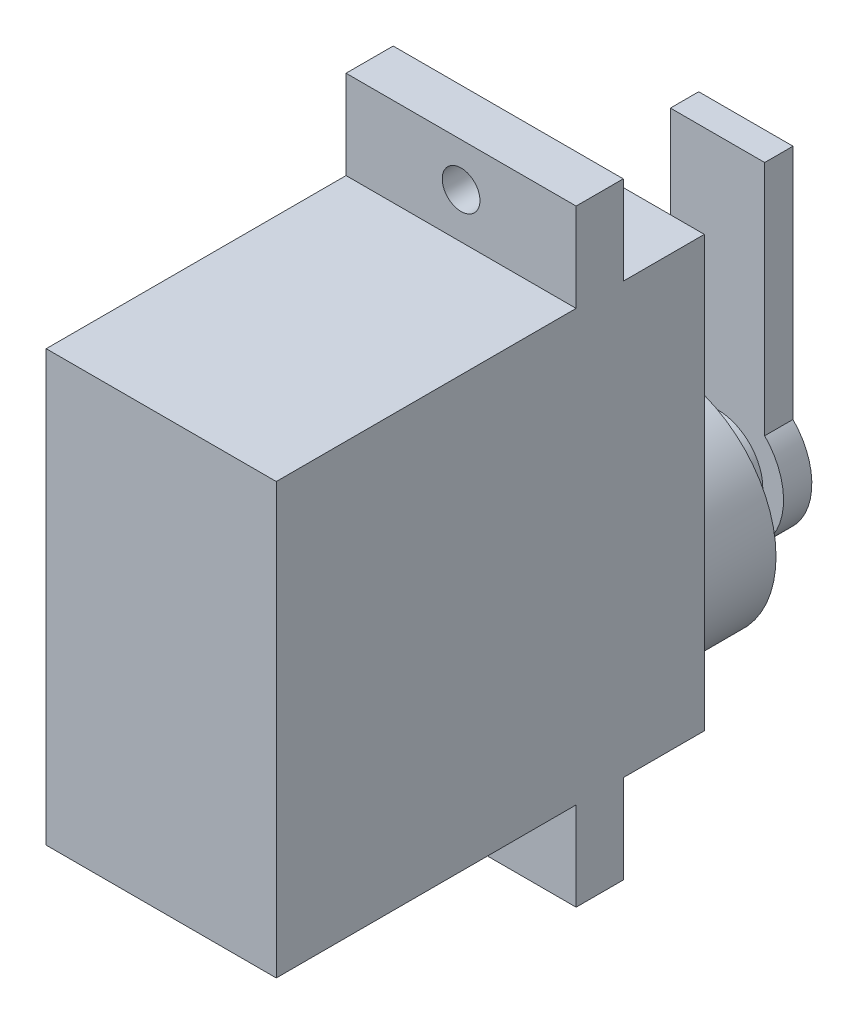
ISO-10303-21;
HEADER;
FILE_DESCRIPTION(('STEP AP214'),'2;1');
FILE_NAME('part.step','',(''),(''),'','','');
FILE_SCHEMA(('AUTOMOTIVE_DESIGN { 1 0 10303 214 1 1 1 1 }'));
ENDSEC;
DATA;
#1=APPLICATION_CONTEXT('core data for automotive mechanical design processes');
#2=APPLICATION_PROTOCOL_DEFINITION('international standard','automotive_design',2000,#1);
#3=PRODUCT_CONTEXT('',#1,'mechanical');
#4=PRODUCT('Part','Part','',(#3));
#5=PRODUCT_RELATED_PRODUCT_CATEGORY('part','',(#4));
#6=PRODUCT_DEFINITION_FORMATION('','',#4);
#7=PRODUCT_DEFINITION_CONTEXT('part definition',#1,'design');
#8=PRODUCT_DEFINITION('design','',#6,#7);
#9=PRODUCT_DEFINITION_SHAPE('','',#8);
#10=(LENGTH_UNIT() NAMED_UNIT(*) SI_UNIT(.MILLI.,.METRE.));
#11=(NAMED_UNIT(*) PLANE_ANGLE_UNIT() SI_UNIT($,.RADIAN.));
#12=(NAMED_UNIT(*) SI_UNIT($,.STERADIAN.) SOLID_ANGLE_UNIT());
#13=UNCERTAINTY_MEASURE_WITH_UNIT(LENGTH_MEASURE(1.E-05),#10,'distance_accuracy_value','');
#14=(GEOMETRIC_REPRESENTATION_CONTEXT(3) GLOBAL_UNCERTAINTY_ASSIGNED_CONTEXT((#13)) GLOBAL_UNIT_ASSIGNED_CONTEXT((#10,
#11,#12)) REPRESENTATION_CONTEXT('',''));
#15=CARTESIAN_POINT('',(0.,0.,0.));
#16=DIRECTION('',(0.,0.,1.));
#17=DIRECTION('',(1.,0.,0.));
#18=AXIS2_PLACEMENT_3D('',#15,#16,#17);
#19=CARTESIAN_POINT('',(0.,0.,-11.1));
#20=DIRECTION('',(0.,0.,-1.));
#21=DIRECTION('',(-1.,0.,0.));
#22=AXIS2_PLACEMENT_3D('',#19,#20,#21);
#23=CYLINDRICAL_SURFACE('',#22,3.5);
#24=DIRECTION('',(0.,0.,-1.));
#25=VECTOR('',#24,1.);
#26=CARTESIAN_POINT('',(-2.5,2.44948974278318,-11.1));
#27=LINE('',#26,#25);
#28=CARTESIAN_POINT('',(-2.5,2.44948974278318,-12.6));
#29=VERTEX_POINT('',#28);
#30=CARTESIAN_POINT('',(-2.5,2.44948974278318,-11.1));
#31=VERTEX_POINT('',#30);
#32=EDGE_CURVE('E190',#29,#31,#27,.F.);
#33=ORIENTED_EDGE('',*,*,#32,.F.);
#34=CARTESIAN_POINT('',(0.,0.,-12.6));
#35=DIRECTION('',(0.,0.,1.));
#36=DIRECTION('',(1.,0.,0.));
#37=AXIS2_PLACEMENT_3D('',#34,#35,#36);
#38=CIRCLE('',#37,3.5);
#39=CARTESIAN_POINT('',(2.5,2.44948974278318,-12.6));
#40=VERTEX_POINT('',#39);
#41=EDGE_CURVE('E192',#29,#40,#38,.T.);
#42=ORIENTED_EDGE('',*,*,#41,.T.);
#43=DIRECTION('',(0.,0.,-1.));
#44=VECTOR('',#43,1.);
#45=CARTESIAN_POINT('',(2.5,2.44948974278318,-11.1));
#46=LINE('',#45,#44);
#47=CARTESIAN_POINT('',(2.5,2.44948974278318,-11.1));
#48=VERTEX_POINT('',#47);
#49=EDGE_CURVE('E63',#48,#40,#46,.T.);
#50=ORIENTED_EDGE('',*,*,#49,.F.);
#51=CARTESIAN_POINT('',(0.,0.,-11.1));
#52=DIRECTION('',(0.,0.,1.));
#53=DIRECTION('',(1.,0.,0.));
#54=AXIS2_PLACEMENT_3D('',#51,#52,#53);
#55=CIRCLE('',#54,3.5);
#56=EDGE_CURVE('E58',#31,#48,#55,.T.);
#57=ORIENTED_EDGE('',*,*,#56,.F.);
#58=EDGE_LOOP('',(#33,#42,#50,#57));
#59=FACE_BOUND('',#58,.T.);
#60=ADVANCED_FACE('F41',(#59),#23,.T.);
#61=CARTESIAN_POINT('',(-6.1,-5.9,18.4));
#62=DIRECTION('',(0.,1.,0.));
#63=DIRECTION('',(0.,0.,1.));
#64=AXIS2_PLACEMENT_3D('',#61,#62,#63);
#65=PLANE('',#64);
#66=DIRECTION('',(1.,0.,0.));
#67=VECTOR('',#66,1.);
#68=CARTESIAN_POINT('',(-6.1,-5.9,0.));
#69=LINE('',#68,#67);
#70=CARTESIAN_POINT('',(-6.1,-5.9,0.));
#71=VERTEX_POINT('',#70);
#72=CARTESIAN_POINT('',(6.1,-5.9,0.));
#73=VERTEX_POINT('',#72);
#74=EDGE_CURVE('E250',#71,#73,#69,.T.);
#75=ORIENTED_EDGE('',*,*,#74,.F.);
#76=DIRECTION('',(0.,0.,-1.));
#77=VECTOR('',#76,1.);
#78=CARTESIAN_POINT('',(-6.1,-5.9,18.4));
#79=LINE('',#78,#77);
#80=CARTESIAN_POINT('',(-6.1,-5.9,-4.3));
#81=VERTEX_POINT('',#80);
#82=EDGE_CURVE('E288',#71,#81,#79,.T.);
#83=ORIENTED_EDGE('',*,*,#82,.T.);
#84=DIRECTION('',(1.,0.,0.));
#85=VECTOR('',#84,1.);
#86=CARTESIAN_POINT('',(-6.1,-5.9,-4.3));
#87=LINE('',#86,#85);
#88=CARTESIAN_POINT('',(0.,-5.9,-4.3));
#89=VERTEX_POINT('',#88);
#90=EDGE_CURVE('E270',#81,#89,#87,.T.);
#91=ORIENTED_EDGE('',*,*,#90,.T.);
#92=CARTESIAN_POINT('',(6.1,-5.9,-4.3));
#93=VERTEX_POINT('',#92);
#94=EDGE_CURVE('E269',#89,#93,#87,.T.);
#95=ORIENTED_EDGE('',*,*,#94,.T.);
#96=DIRECTION('',(0.,0.,-1.));
#97=VECTOR('',#96,1.);
#98=CARTESIAN_POINT('',(6.1,-5.9,18.4));
#99=LINE('',#98,#97);
#100=EDGE_CURVE('E284',#73,#93,#99,.T.);
#101=ORIENTED_EDGE('',*,*,#100,.F.);
#102=EDGE_LOOP('',(#75,#83,#91,#95,#101));
#103=FACE_BOUND('',#102,.T.);
#104=ADVANCED_FACE('F314',(#103),#65,.F.);
#105=CARTESIAN_POINT('',(6.1,16.9,18.4));
#106=DIRECTION('',(0.,-1.,0.));
#107=DIRECTION('',(0.,0.,-1.));
#108=AXIS2_PLACEMENT_3D('',#105,#106,#107);
#109=PLANE('',#108);
#110=DIRECTION('',(-1.,0.,0.));
#111=VECTOR('',#110,1.);
#112=CARTESIAN_POINT('',(6.1,16.9,0.));
#113=LINE('',#112,#111);
#114=CARTESIAN_POINT('',(6.1,16.9,0.));
#115=VERTEX_POINT('',#114);
#116=CARTESIAN_POINT('',(-6.1,16.9,0.));
#117=VERTEX_POINT('',#116);
#118=EDGE_CURVE('E50',#115,#117,#113,.T.);
#119=ORIENTED_EDGE('',*,*,#118,.F.);
#120=DIRECTION('',(0.,0.,-1.));
#121=VECTOR('',#120,1.);
#122=CARTESIAN_POINT('',(6.1,16.9,18.4));
#123=LINE('',#122,#121);
#124=CARTESIAN_POINT('',(6.1,16.9,-4.3));
#125=VERTEX_POINT('',#124);
#126=EDGE_CURVE('E281',#115,#125,#123,.T.);
#127=ORIENTED_EDGE('',*,*,#126,.T.);
#128=DIRECTION('',(-1.,0.,0.));
#129=VECTOR('',#128,1.);
#130=CARTESIAN_POINT('',(6.1,16.9,-4.3));
#131=LINE('',#130,#129);
#132=CARTESIAN_POINT('',(-6.1,16.9,-4.3));
#133=VERTEX_POINT('',#132);
#134=EDGE_CURVE('E260',#125,#133,#131,.T.);
#135=ORIENTED_EDGE('',*,*,#134,.T.);
#136=DIRECTION('',(0.,0.,-1.));
#137=VECTOR('',#136,1.);
#138=CARTESIAN_POINT('',(-6.1,16.9,18.4));
#139=LINE('',#138,#137);
#140=EDGE_CURVE('E266',#117,#133,#139,.T.);
#141=ORIENTED_EDGE('',*,*,#140,.F.);
#142=EDGE_LOOP('',(#119,#127,#135,#141));
#143=FACE_BOUND('',#142,.T.);
#144=ADVANCED_FACE('F343',(#143),#109,.F.);
#145=CARTESIAN_POINT('',(-6.1,16.9,18.4));
#146=DIRECTION('',(1.,0.,0.));
#147=DIRECTION('',(0.,0.,-1.));
#148=AXIS2_PLACEMENT_3D('',#145,#146,#147);
#149=PLANE('',#148);
#150=CARTESIAN_POINT('',(-6.1,16.9,18.4));
#151=VERTEX_POINT('',#150);
#152=CARTESIAN_POINT('',(-6.1,16.9,2.5));
#153=VERTEX_POINT('',#152);
#154=EDGE_CURVE('E278',#151,#153,#139,.T.);
#155=ORIENTED_EDGE('',*,*,#154,.T.);
#156=DIRECTION('',(0.,-1.,0.));
#157=VECTOR('',#156,1.);
#158=CARTESIAN_POINT('',(-6.1,21.6,2.5));
#159=LINE('',#158,#157);
#160=CARTESIAN_POINT('',(-6.1,21.6,2.5));
#161=VERTEX_POINT('',#160);
#162=EDGE_CURVE('E215',#161,#153,#159,.T.);
#163=ORIENTED_EDGE('',*,*,#162,.F.);
#164=DIRECTION('',(0.,0.,-1.));
#165=VECTOR('',#164,1.);
#166=CARTESIAN_POINT('',(-6.1,21.6,2.5));
#167=LINE('',#166,#165);
#168=CARTESIAN_POINT('',(-6.1,21.6,0.));
#169=VERTEX_POINT('',#168);
#170=EDGE_CURVE('E227',#161,#169,#167,.T.);
#171=ORIENTED_EDGE('',*,*,#170,.T.);
#172=DIRECTION('',(0.,-1.,0.));
#173=VECTOR('',#172,1.);
#174=CARTESIAN_POINT('',(-6.1,21.6,0.));
#175=LINE('',#174,#173);
#176=EDGE_CURVE('E228',#169,#117,#175,.T.);
#177=ORIENTED_EDGE('',*,*,#176,.T.);
#178=ORIENTED_EDGE('',*,*,#140,.T.);
#179=DIRECTION('',(0.,-1.,0.));
#180=VECTOR('',#179,1.);
#181=CARTESIAN_POINT('',(-6.1,16.9,-4.3));
#182=LINE('',#181,#180);
#183=EDGE_CURVE('E255',#133,#81,#182,.T.);
#184=ORIENTED_EDGE('',*,*,#183,.T.);
#185=ORIENTED_EDGE('',*,*,#82,.F.);
#186=CARTESIAN_POINT('',(-6.1,-10.6,0.));
#187=VERTEX_POINT('',#186);
#188=EDGE_CURVE('E214',#71,#187,#175,.T.);
#189=ORIENTED_EDGE('',*,*,#188,.T.);
#190=DIRECTION('',(0.,0.,-1.));
#191=VECTOR('',#190,1.);
#192=CARTESIAN_POINT('',(-6.1,-10.6,2.5));
#193=LINE('',#192,#191);
#194=CARTESIAN_POINT('',(-6.1,-10.6,2.5));
#195=VERTEX_POINT('',#194);
#196=EDGE_CURVE('E247',#195,#187,#193,.T.);
#197=ORIENTED_EDGE('',*,*,#196,.F.);
#198=CARTESIAN_POINT('',(-6.1,-5.9,2.5));
#199=VERTEX_POINT('',#198);
#200=EDGE_CURVE('E219',#199,#195,#159,.T.);
#201=ORIENTED_EDGE('',*,*,#200,.F.);
#202=CARTESIAN_POINT('',(-6.1,-5.9,18.4));
#203=VERTEX_POINT('',#202);
#204=EDGE_CURVE('E289',#203,#199,#79,.T.);
#205=ORIENTED_EDGE('',*,*,#204,.F.);
#206=DIRECTION('',(0.,-1.,0.));
#207=VECTOR('',#206,1.);
#208=CARTESIAN_POINT('',(-6.1,16.9,18.4));
#209=LINE('',#208,#207);
#210=EDGE_CURVE('E256',#151,#203,#209,.T.);
#211=ORIENTED_EDGE('',*,*,#210,.F.);
#212=EDGE_LOOP('',(#155,#163,#171,#177,#178,#184,#185,#189,#197,#201,#205,#211));
#213=FACE_BOUND('',#212,.T.);
#214=ADVANCED_FACE('F43',(#213),#149,.F.);
#215=ORIENTED_EDGE('',*,*,#204,.T.);
#216=DIRECTION('',(1.,0.,0.));
#217=VECTOR('',#216,1.);
#218=CARTESIAN_POINT('',(-6.1,-5.9,2.5));
#219=LINE('',#218,#217);
#220=CARTESIAN_POINT('',(6.1,-5.9,2.5));
#221=VERTEX_POINT('',#220);
#222=EDGE_CURVE('E253',#199,#221,#219,.T.);
#223=ORIENTED_EDGE('',*,*,#222,.T.);
#224=CARTESIAN_POINT('',(6.1,-5.9,18.4));
#225=VERTEX_POINT('',#224);
#226=EDGE_CURVE('E285',#225,#221,#99,.T.);
#227=ORIENTED_EDGE('',*,*,#226,.F.);
#228=DIRECTION('',(1.,0.,0.));
#229=VECTOR('',#228,1.);
#230=CARTESIAN_POINT('',(-6.1,-5.9,18.4));
#231=LINE('',#230,#229);
#232=EDGE_CURVE('E259',#203,#225,#231,.T.);
#233=ORIENTED_EDGE('',*,*,#232,.F.);
#234=EDGE_LOOP('',(#215,#223,#227,#233));
#235=FACE_BOUND('',#234,.T.);
#236=ADVANCED_FACE('F344',(#235),#65,.F.);
#237=CARTESIAN_POINT('',(6.1,-5.9,18.4));
#238=DIRECTION('',(-1.,0.,0.));
#239=DIRECTION('',(0.,0.,1.));
#240=AXIS2_PLACEMENT_3D('',#237,#238,#239);
#241=PLANE('',#240);
#242=ORIENTED_EDGE('',*,*,#226,.T.);
#243=DIRECTION('',(0.,1.,0.));
#244=VECTOR('',#243,1.);
#245=CARTESIAN_POINT('',(6.1,-10.6,2.5));
#246=LINE('',#245,#244);
#247=CARTESIAN_POINT('',(6.1,-10.6,2.5));
#248=VERTEX_POINT('',#247);
#249=EDGE_CURVE('E222',#248,#221,#246,.T.);
#250=ORIENTED_EDGE('',*,*,#249,.F.);
#251=DIRECTION('',(0.,0.,-1.));
#252=VECTOR('',#251,1.);
#253=CARTESIAN_POINT('',(6.1,-10.6,2.5));
#254=LINE('',#253,#252);
#255=CARTESIAN_POINT('',(6.1,-10.6,0.));
#256=VERTEX_POINT('',#255);
#257=EDGE_CURVE('E244',#248,#256,#254,.T.);
#258=ORIENTED_EDGE('',*,*,#257,.T.);
#259=DIRECTION('',(0.,1.,0.));
#260=VECTOR('',#259,1.);
#261=CARTESIAN_POINT('',(6.1,-10.6,0.));
#262=LINE('',#261,#260);
#263=EDGE_CURVE('E234',#256,#73,#262,.T.);
#264=ORIENTED_EDGE('',*,*,#263,.T.);
#265=ORIENTED_EDGE('',*,*,#100,.T.);
#266=DIRECTION('',(0.,1.,0.));
#267=VECTOR('',#266,1.);
#268=CARTESIAN_POINT('',(6.1,-5.9,-4.3));
#269=LINE('',#268,#267);
#270=EDGE_CURVE('E273',#93,#125,#269,.T.);
#271=ORIENTED_EDGE('',*,*,#270,.T.);
#272=ORIENTED_EDGE('',*,*,#126,.F.);
#273=CARTESIAN_POINT('',(6.1,21.6,0.));
#274=VERTEX_POINT('',#273);
#275=EDGE_CURVE('E233',#115,#274,#262,.T.);
#276=ORIENTED_EDGE('',*,*,#275,.T.);
#277=DIRECTION('',(0.,0.,-1.));
#278=VECTOR('',#277,1.);
#279=CARTESIAN_POINT('',(6.1,21.6,2.5));
#280=LINE('',#279,#278);
#281=CARTESIAN_POINT('',(6.1,21.6,2.5));
#282=VERTEX_POINT('',#281);
#283=EDGE_CURVE('E241',#282,#274,#280,.T.);
#284=ORIENTED_EDGE('',*,*,#283,.F.);
#285=CARTESIAN_POINT('',(6.1,16.9,2.5));
#286=VERTEX_POINT('',#285);
#287=EDGE_CURVE('E221',#286,#282,#246,.T.);
#288=ORIENTED_EDGE('',*,*,#287,.F.);
#289=CARTESIAN_POINT('',(6.1,16.9,18.4));
#290=VERTEX_POINT('',#289);
#291=EDGE_CURVE('E282',#290,#286,#123,.T.);
#292=ORIENTED_EDGE('',*,*,#291,.F.);
#293=DIRECTION('',(0.,1.,0.));
#294=VECTOR('',#293,1.);
#295=CARTESIAN_POINT('',(6.1,-5.9,18.4));
#296=LINE('',#295,#294);
#297=EDGE_CURVE('E262',#225,#290,#296,.T.);
#298=ORIENTED_EDGE('',*,*,#297,.F.);
#299=EDGE_LOOP('',(#242,#250,#258,#264,#265,#271,#272,#276,#284,#288,#292,#298));
#300=FACE_BOUND('',#299,.T.);
#301=ADVANCED_FACE('F488',(#300),#241,.F.);
#302=ORIENTED_EDGE('',*,*,#291,.T.);
#303=DIRECTION('',(-1.,0.,0.));
#304=VECTOR('',#303,1.);
#305=CARTESIAN_POINT('',(6.1,16.9,2.5));
#306=LINE('',#305,#304);
#307=EDGE_CURVE('E11',#286,#153,#306,.T.);
#308=ORIENTED_EDGE('',*,*,#307,.T.);
#309=ORIENTED_EDGE('',*,*,#154,.F.);
#310=DIRECTION('',(-1.,0.,0.));
#311=VECTOR('',#310,1.);
#312=CARTESIAN_POINT('',(6.1,16.9,18.4));
#313=LINE('',#312,#311);
#314=EDGE_CURVE('E264',#290,#151,#313,.T.);
#315=ORIENTED_EDGE('',*,*,#314,.F.);
#316=EDGE_LOOP('',(#302,#308,#309,#315));
#317=FACE_BOUND('',#316,.T.);
#318=ADVANCED_FACE('F494',(#317),#109,.F.);
#319=CARTESIAN_POINT('',(0.,0.,18.4));
#320=DIRECTION('',(0.,0.,1.));
#321=DIRECTION('',(1.,0.,0.));
#322=AXIS2_PLACEMENT_3D('',#319,#320,#321);
#323=PLANE('',#322);
#324=ORIENTED_EDGE('',*,*,#210,.T.);
#325=ORIENTED_EDGE('',*,*,#232,.T.);
#326=ORIENTED_EDGE('',*,*,#297,.T.);
#327=ORIENTED_EDGE('',*,*,#314,.T.);
#328=EDGE_LOOP('',(#324,#325,#326,#327));
#329=FACE_BOUND('',#328,.T.);
#330=ADVANCED_FACE('F529',(#329),#323,.T.);
#331=CARTESIAN_POINT('',(0.,0.,-4.3));
#332=DIRECTION('',(0.,0.,1.));
#333=DIRECTION('',(1.,0.,0.));
#334=AXIS2_PLACEMENT_3D('',#331,#332,#333);
#335=PLANE('',#334);
#336=ORIENTED_EDGE('',*,*,#94,.F.);
#337=CARTESIAN_POINT('',(0.,0.,-4.3));
#338=DIRECTION('',(0.,0.,1.));
#339=DIRECTION('',(1.,0.,0.));
#340=AXIS2_PLACEMENT_3D('',#337,#338,#339);
#341=CIRCLE('',#340,5.9);
#342=EDGE_CURVE('E202',#89,#89,#341,.T.);
#343=ORIENTED_EDGE('',*,*,#342,.T.);
#344=ORIENTED_EDGE('',*,*,#90,.F.);
#345=ORIENTED_EDGE('',*,*,#183,.F.);
#346=ORIENTED_EDGE('',*,*,#134,.F.);
#347=ORIENTED_EDGE('',*,*,#270,.F.);
#348=EDGE_LOOP('',(#336,#343,#344,#345,#346,#347));
#349=FACE_BOUND('',#348,.T.);
#350=ADVANCED_FACE('F317',(#349),#335,.F.);
#351=CARTESIAN_POINT('',(6.1,21.6,2.5));
#352=DIRECTION('',(0.,-1.,0.));
#353=DIRECTION('',(0.,0.,-1.));
#354=AXIS2_PLACEMENT_3D('',#351,#352,#353);
#355=PLANE('',#354);
#356=DIRECTION('',(-1.,0.,0.));
#357=VECTOR('',#356,1.);
#358=CARTESIAN_POINT('',(6.1,21.6,0.));
#359=LINE('',#358,#357);
#360=EDGE_CURVE('E237',#274,#169,#359,.T.);
#361=ORIENTED_EDGE('',*,*,#360,.T.);
#362=ORIENTED_EDGE('',*,*,#170,.F.);
#363=DIRECTION('',(-1.,0.,0.));
#364=VECTOR('',#363,1.);
#365=CARTESIAN_POINT('',(6.1,21.6,2.5));
#366=LINE('',#365,#364);
#367=EDGE_CURVE('E225',#282,#161,#366,.T.);
#368=ORIENTED_EDGE('',*,*,#367,.F.);
#369=ORIENTED_EDGE('',*,*,#283,.T.);
#370=EDGE_LOOP('',(#361,#362,#368,#369));
#371=FACE_BOUND('',#370,.T.);
#372=ADVANCED_FACE('F474',(#371),#355,.F.);
#373=CARTESIAN_POINT('',(0.,0.,0.));
#374=DIRECTION('',(0.,0.,1.));
#375=DIRECTION('',(1.,0.,0.));
#376=AXIS2_PLACEMENT_3D('',#373,#374,#375);
#377=PLANE('',#376);
#378=CARTESIAN_POINT('',(0.,19.3,0.));
#379=DIRECTION('',(0.,0.,1.));
#380=DIRECTION('',(1.,0.,0.));
#381=AXIS2_PLACEMENT_3D('',#378,#379,#380);
#382=CIRCLE('',#381,1.);
#383=CARTESIAN_POINT('',(1.,19.3,0.));
#384=VERTEX_POINT('',#383);
#385=EDGE_CURVE('E211',#384,#384,#382,.F.);
#386=ORIENTED_EDGE('',*,*,#385,.F.);
#387=EDGE_LOOP('',(#386));
#388=FACE_BOUND('',#387,.T.);
#389=ORIENTED_EDGE('',*,*,#275,.F.);
#390=ORIENTED_EDGE('',*,*,#118,.T.);
#391=ORIENTED_EDGE('',*,*,#176,.F.);
#392=ORIENTED_EDGE('',*,*,#360,.F.);
#393=EDGE_LOOP('',(#389,#390,#391,#392));
#394=FACE_BOUND('',#393,.T.);
#395=ADVANCED_FACE('F303',(#388,#394),#377,.F.);
#396=CARTESIAN_POINT('',(0.,0.,2.5));
#397=DIRECTION('',(0.,0.,1.));
#398=DIRECTION('',(1.,0.,0.));
#399=AXIS2_PLACEMENT_3D('',#396,#397,#398);
#400=PLANE('',#399);
#401=CARTESIAN_POINT('',(0.,19.3,2.5));
#402=DIRECTION('',(0.,0.,1.));
#403=DIRECTION('',(1.,0.,0.));
#404=AXIS2_PLACEMENT_3D('',#401,#402,#403);
#405=CIRCLE('',#404,1.);
#406=CARTESIAN_POINT('',(1.,19.3,2.5));
#407=VERTEX_POINT('',#406);
#408=EDGE_CURVE('E45',#407,#407,#405,.F.);
#409=ORIENTED_EDGE('',*,*,#408,.T.);
#410=EDGE_LOOP('',(#409));
#411=FACE_BOUND('',#410,.T.);
#412=ORIENTED_EDGE('',*,*,#307,.F.);
#413=ORIENTED_EDGE('',*,*,#287,.T.);
#414=ORIENTED_EDGE('',*,*,#367,.T.);
#415=ORIENTED_EDGE('',*,*,#162,.T.);
#416=EDGE_LOOP('',(#412,#413,#414,#415));
#417=FACE_BOUND('',#416,.T.);
#418=ADVANCED_FACE('F457',(#411,#417),#400,.T.);
#419=CARTESIAN_POINT('',(0.,-8.3,2.5));
#420=DIRECTION('',(0.,0.,1.));
#421=DIRECTION('',(1.,0.,0.));
#422=AXIS2_PLACEMENT_3D('',#419,#420,#421);
#423=CIRCLE('',#422,1.);
#424=CARTESIAN_POINT('',(1.,-8.3,2.5));
#425=VERTEX_POINT('',#424);
#426=EDGE_CURVE('E208',#425,#425,#423,.F.);
#427=ORIENTED_EDGE('',*,*,#426,.T.);
#428=EDGE_LOOP('',(#427));
#429=FACE_BOUND('',#428,.T.);
#430=ORIENTED_EDGE('',*,*,#222,.F.);
#431=ORIENTED_EDGE('',*,*,#200,.T.);
#432=DIRECTION('',(1.,0.,0.));
#433=VECTOR('',#432,1.);
#434=CARTESIAN_POINT('',(-6.1,-10.6,2.5));
#435=LINE('',#434,#433);
#436=EDGE_CURVE('E218',#195,#248,#435,.T.);
#437=ORIENTED_EDGE('',*,*,#436,.T.);
#438=ORIENTED_EDGE('',*,*,#249,.T.);
#439=EDGE_LOOP('',(#430,#431,#437,#438));
#440=FACE_BOUND('',#439,.T.);
#441=ADVANCED_FACE('F301',(#429,#440),#400,.T.);
#442=CARTESIAN_POINT('',(0.,-8.3,0.));
#443=DIRECTION('',(0.,0.,1.));
#444=DIRECTION('',(1.,0.,0.));
#445=AXIS2_PLACEMENT_3D('',#442,#443,#444);
#446=CIRCLE('',#445,1.);
#447=CARTESIAN_POINT('',(1.,-8.3,0.));
#448=VERTEX_POINT('',#447);
#449=EDGE_CURVE('E205',#448,#448,#446,.F.);
#450=ORIENTED_EDGE('',*,*,#449,.F.);
#451=EDGE_LOOP('',(#450));
#452=FACE_BOUND('',#451,.T.);
#453=ORIENTED_EDGE('',*,*,#188,.F.);
#454=ORIENTED_EDGE('',*,*,#74,.T.);
#455=ORIENTED_EDGE('',*,*,#263,.F.);
#456=DIRECTION('',(1.,0.,0.));
#457=VECTOR('',#456,1.);
#458=CARTESIAN_POINT('',(-6.1,-10.6,0.));
#459=LINE('',#458,#457);
#460=EDGE_CURVE('E231',#187,#256,#459,.T.);
#461=ORIENTED_EDGE('',*,*,#460,.F.);
#462=EDGE_LOOP('',(#453,#454,#455,#461));
#463=FACE_BOUND('',#462,.T.);
#464=ADVANCED_FACE('F297',(#452,#463),#377,.F.);
#465=CARTESIAN_POINT('',(-6.1,-10.6,2.5));
#466=DIRECTION('',(0.,1.,0.));
#467=DIRECTION('',(0.,0.,1.));
#468=AXIS2_PLACEMENT_3D('',#465,#466,#467);
#469=PLANE('',#468);
#470=ORIENTED_EDGE('',*,*,#460,.T.);
#471=ORIENTED_EDGE('',*,*,#257,.F.);
#472=ORIENTED_EDGE('',*,*,#436,.F.);
#473=ORIENTED_EDGE('',*,*,#196,.T.);
#474=EDGE_LOOP('',(#470,#471,#472,#473));
#475=FACE_BOUND('',#474,.T.);
#476=ADVANCED_FACE('F300',(#475),#469,.F.);
#477=CARTESIAN_POINT('',(0.,-8.3,3.5));
#478=DIRECTION('',(0.,0.,-1.));
#479=DIRECTION('',(-1.,0.,0.));
#480=AXIS2_PLACEMENT_3D('',#477,#478,#479);
#481=CYLINDRICAL_SURFACE('',#480,1.);
#482=ORIENTED_EDGE('',*,*,#426,.F.);
#483=EDGE_LOOP('',(#482));
#484=FACE_BOUND('',#483,.T.);
#485=ORIENTED_EDGE('',*,*,#449,.T.);
#486=EDGE_LOOP('',(#485));
#487=FACE_BOUND('',#486,.T.);
#488=ADVANCED_FACE('F295',(#484,#487),#481,.F.);
#489=CARTESIAN_POINT('',(0.,19.3,3.5));
#490=DIRECTION('',(0.,0.,-1.));
#491=DIRECTION('',(-1.,0.,0.));
#492=AXIS2_PLACEMENT_3D('',#489,#490,#491);
#493=CYLINDRICAL_SURFACE('',#492,1.);
#494=ORIENTED_EDGE('',*,*,#408,.F.);
#495=EDGE_LOOP('',(#494));
#496=FACE_BOUND('',#495,.T.);
#497=ORIENTED_EDGE('',*,*,#385,.T.);
#498=EDGE_LOOP('',(#497));
#499=FACE_BOUND('',#498,.T.);
#500=ADVANCED_FACE('F325',(#496,#499),#493,.F.);
#501=CARTESIAN_POINT('',(0.,0.,-4.3));
#502=DIRECTION('',(0.,0.,-1.));
#503=DIRECTION('',(-1.,0.,0.));
#504=AXIS2_PLACEMENT_3D('',#501,#502,#503);
#505=CYLINDRICAL_SURFACE('',#504,5.9);
#506=ORIENTED_EDGE('',*,*,#342,.F.);
#507=EDGE_LOOP('',(#506));
#508=FACE_BOUND('',#507,.T.);
#509=CARTESIAN_POINT('',(0.,0.,-8.3));
#510=DIRECTION('',(0.,0.,1.));
#511=DIRECTION('',(1.,0.,0.));
#512=AXIS2_PLACEMENT_3D('',#509,#510,#511);
#513=CIRCLE('',#512,5.9);
#514=CARTESIAN_POINT('',(5.9,0.,-8.3));
#515=VERTEX_POINT('',#514);
#516=EDGE_CURVE('E199',#515,#515,#513,.T.);
#517=ORIENTED_EDGE('',*,*,#516,.T.);
#518=EDGE_LOOP('',(#517));
#519=FACE_BOUND('',#518,.T.);
#520=ADVANCED_FACE('F321',(#508,#519),#505,.T.);
#521=CARTESIAN_POINT('',(0.,0.,-8.3));
#522=DIRECTION('',(0.,0.,1.));
#523=DIRECTION('',(1.,0.,0.));
#524=AXIS2_PLACEMENT_3D('',#521,#522,#523);
#525=PLANE('',#524);
#526=CARTESIAN_POINT('',(0.,0.,-8.3));
#527=DIRECTION('',(0.,0.,1.));
#528=DIRECTION('',(1.,0.,0.));
#529=AXIS2_PLACEMENT_3D('',#526,#527,#528);
#530=CIRCLE('',#529,2.4);
#531=CARTESIAN_POINT('',(2.4,0.,-8.3));
#532=VERTEX_POINT('',#531);
#533=EDGE_CURVE('E196',#532,#532,#530,.T.);
#534=ORIENTED_EDGE('',*,*,#533,.T.);
#535=EDGE_LOOP('',(#534));
#536=FACE_BOUND('',#535,.T.);
#537=ORIENTED_EDGE('',*,*,#516,.F.);
#538=EDGE_LOOP('',(#537));
#539=FACE_BOUND('',#538,.T.);
#540=ADVANCED_FACE('F324',(#536,#539),#525,.F.);
#541=CARTESIAN_POINT('',(0.,0.,-8.3));
#542=DIRECTION('',(0.,0.,-1.));
#543=DIRECTION('',(-1.,0.,0.));
#544=AXIS2_PLACEMENT_3D('',#541,#542,#543);
#545=CYLINDRICAL_SURFACE('',#544,2.4);
#546=ORIENTED_EDGE('',*,*,#533,.F.);
#547=EDGE_LOOP('',(#546));
#548=FACE_BOUND('',#547,.T.);
#549=CARTESIAN_POINT('',(0.,0.,-11.1));
#550=DIRECTION('',(0.,0.,1.));
#551=DIRECTION('',(1.,0.,0.));
#552=AXIS2_PLACEMENT_3D('',#549,#550,#551);
#553=CIRCLE('',#552,2.4);
#554=CARTESIAN_POINT('',(2.4,0.,-11.1));
#555=VERTEX_POINT('',#554);
#556=EDGE_CURVE('E194',#555,#555,#553,.T.);
#557=ORIENTED_EDGE('',*,*,#556,.T.);
#558=EDGE_LOOP('',(#557));
#559=FACE_BOUND('',#558,.T.);
#560=ADVANCED_FACE('F330',(#548,#559),#545,.T.);
#561=CARTESIAN_POINT('',(0.,0.,-11.1));
#562=DIRECTION('',(0.,0.,1.));
#563=DIRECTION('',(1.,0.,0.));
#564=AXIS2_PLACEMENT_3D('',#561,#562,#563);
#565=PLANE('',#564);
#566=ORIENTED_EDGE('',*,*,#56,.T.);
#567=DIRECTION('',(0.,1.,0.));
#568=VECTOR('',#567,1.);
#569=CARTESIAN_POINT('',(2.5,2.,-11.1));
#570=LINE('',#569,#568);
#571=CARTESIAN_POINT('',(2.5,15.,-11.1));
#572=VERTEX_POINT('',#571);
#573=EDGE_CURVE('E156',#48,#572,#570,.T.);
#574=ORIENTED_EDGE('',*,*,#573,.T.);
#575=DIRECTION('',(-1.,0.,0.));
#576=VECTOR('',#575,1.);
#577=CARTESIAN_POINT('',(2.5,15.,-11.1));
#578=LINE('',#577,#576);
#579=CARTESIAN_POINT('',(-2.5,15.,-11.1));
#580=VERTEX_POINT('',#579);
#581=EDGE_CURVE('E162',#572,#580,#578,.T.);
#582=ORIENTED_EDGE('',*,*,#581,.T.);
#583=DIRECTION('',(0.,-1.,0.));
#584=VECTOR('',#583,1.);
#585=CARTESIAN_POINT('',(-2.5,15.,-11.1));
#586=LINE('',#585,#584);
#587=EDGE_CURVE('E165',#580,#31,#586,.T.);
#588=ORIENTED_EDGE('',*,*,#587,.T.);
#589=EDGE_LOOP('',(#566,#574,#582,#588));
#590=FACE_BOUND('',#589,.T.);
#591=ORIENTED_EDGE('',*,*,#556,.F.);
#592=EDGE_LOOP('',(#591));
#593=FACE_BOUND('',#592,.T.);
#594=ADVANCED_FACE('F158',(#590,#593),#565,.T.);
#595=CARTESIAN_POINT('',(0.,0.,-12.6));
#596=DIRECTION('',(0.,0.,1.));
#597=DIRECTION('',(1.,0.,0.));
#598=AXIS2_PLACEMENT_3D('',#595,#596,#597);
#599=PLANE('',#598);
#600=ORIENTED_EDGE('',*,*,#41,.F.);
#601=DIRECTION('',(0.,-1.,0.));
#602=VECTOR('',#601,1.);
#603=CARTESIAN_POINT('',(-2.5,15.,-12.6));
#604=LINE('',#603,#602);
#605=CARTESIAN_POINT('',(-2.5,15.,-12.6));
#606=VERTEX_POINT('',#605);
#607=EDGE_CURVE('E183',#606,#29,#604,.T.);
#608=ORIENTED_EDGE('',*,*,#607,.F.);
#609=DIRECTION('',(-1.,0.,0.));
#610=VECTOR('',#609,1.);
#611=CARTESIAN_POINT('',(2.5,15.,-12.6));
#612=LINE('',#611,#610);
#613=CARTESIAN_POINT('',(2.5,15.,-12.6));
#614=VERTEX_POINT('',#613);
#615=EDGE_CURVE('E187',#614,#606,#612,.T.);
#616=ORIENTED_EDGE('',*,*,#615,.F.);
#617=DIRECTION('',(0.,1.,0.));
#618=VECTOR('',#617,1.);
#619=CARTESIAN_POINT('',(2.5,2.,-12.6));
#620=LINE('',#619,#618);
#621=EDGE_CURVE('E171',#40,#614,#620,.T.);
#622=ORIENTED_EDGE('',*,*,#621,.F.);
#623=EDGE_LOOP('',(#600,#608,#616,#622));
#624=FACE_BOUND('',#623,.T.);
#625=ADVANCED_FACE('F346',(#624),#599,.F.);
#626=CARTESIAN_POINT('',(-2.5,15.,-11.1));
#627=DIRECTION('',(1.,0.,0.));
#628=DIRECTION('',(0.,0.,-1.));
#629=AXIS2_PLACEMENT_3D('',#626,#627,#628);
#630=PLANE('',#629);
#631=ORIENTED_EDGE('',*,*,#607,.T.);
#632=ORIENTED_EDGE('',*,*,#32,.T.);
#633=ORIENTED_EDGE('',*,*,#587,.F.);
#634=DIRECTION('',(0.,0.,-1.));
#635=VECTOR('',#634,1.);
#636=CARTESIAN_POINT('',(-2.5,15.,-11.1));
#637=LINE('',#636,#635);
#638=EDGE_CURVE('E174',#580,#606,#637,.T.);
#639=ORIENTED_EDGE('',*,*,#638,.T.);
#640=EDGE_LOOP('',(#631,#632,#633,#639));
#641=FACE_BOUND('',#640,.T.);
#642=ADVANCED_FACE('F349',(#641),#630,.F.);
#643=CARTESIAN_POINT('',(2.5,2.,-11.1));
#644=DIRECTION('',(-1.,0.,0.));
#645=DIRECTION('',(0.,0.,1.));
#646=AXIS2_PLACEMENT_3D('',#643,#644,#645);
#647=PLANE('',#646);
#648=ORIENTED_EDGE('',*,*,#573,.F.);
#649=ORIENTED_EDGE('',*,*,#49,.T.);
#650=ORIENTED_EDGE('',*,*,#621,.T.);
#651=DIRECTION('',(0.,0.,-1.));
#652=VECTOR('',#651,1.);
#653=CARTESIAN_POINT('',(2.5,15.,-11.1));
#654=LINE('',#653,#652);
#655=EDGE_CURVE('E168',#572,#614,#654,.T.);
#656=ORIENTED_EDGE('',*,*,#655,.F.);
#657=EDGE_LOOP('',(#648,#649,#650,#656));
#658=FACE_BOUND('',#657,.T.);
#659=ADVANCED_FACE('F169',(#658),#647,.F.);
#660=CARTESIAN_POINT('',(2.5,15.,-11.1));
#661=DIRECTION('',(0.,-1.,0.));
#662=DIRECTION('',(0.,0.,-1.));
#663=AXIS2_PLACEMENT_3D('',#660,#661,#662);
#664=PLANE('',#663);
#665=ORIENTED_EDGE('',*,*,#615,.T.);
#666=ORIENTED_EDGE('',*,*,#638,.F.);
#667=ORIENTED_EDGE('',*,*,#581,.F.);
#668=ORIENTED_EDGE('',*,*,#655,.T.);
#669=EDGE_LOOP('',(#665,#666,#667,#668));
#670=FACE_BOUND('',#669,.T.);
#671=ADVANCED_FACE('F176',(#670),#664,.F.);
#672=CLOSED_SHELL('',(#60,#104,#144,#214,#236,#301,#318,#330,#350,#372,#395,#418,#441,#464,#476,
#488,#500,#520,#540,#560,#594,#625,#642,#659,#671));
#673=MANIFOLD_SOLID_BREP('B2',#672);
#674=ADVANCED_BREP_SHAPE_REPRESENTATION('',(#18,#673),#14);
#675=SHAPE_DEFINITION_REPRESENTATION(#9,#674);
ENDSEC;
END-ISO-10303-21;
